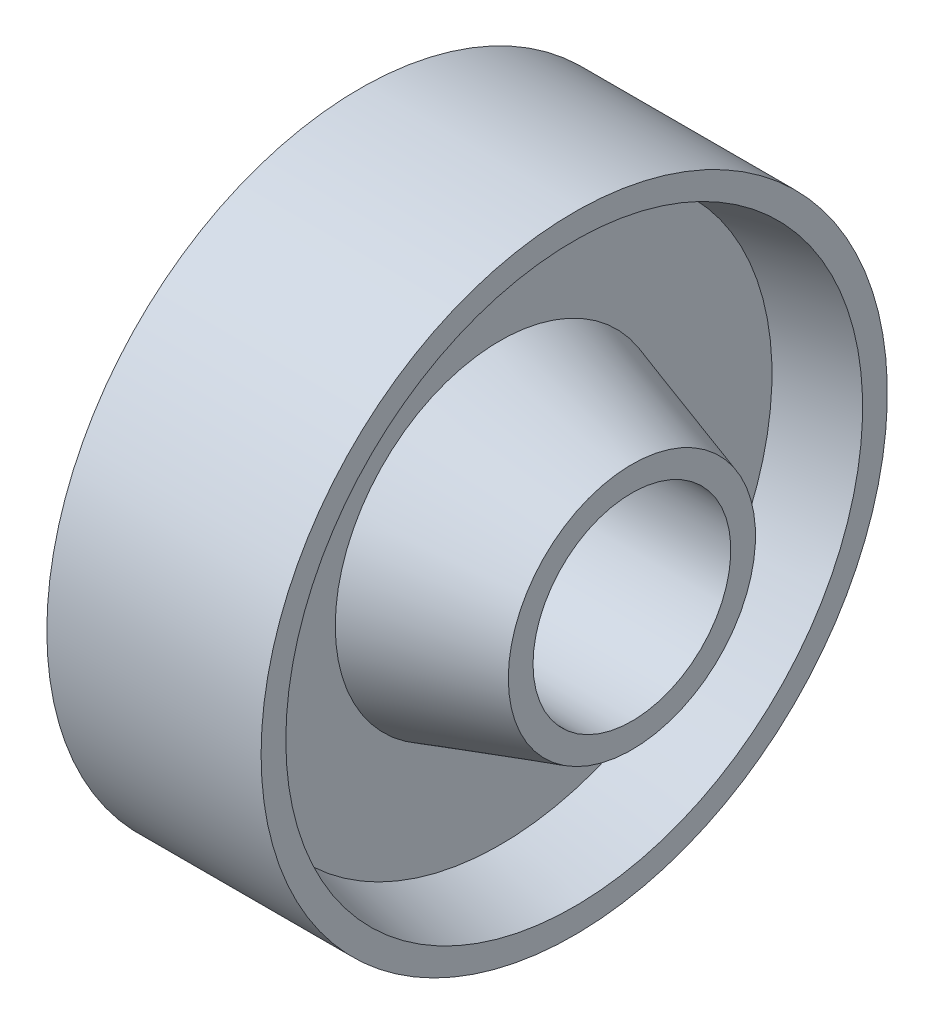
ISO-10303-21;
HEADER;
FILE_DESCRIPTION(('STEP AP214'),'2;1');
FILE_NAME('part.step','',(''),(''),'','','');
FILE_SCHEMA(('AUTOMOTIVE_DESIGN { 1 0 10303 214 1 1 1 1 }'));
ENDSEC;
DATA;
#1=APPLICATION_CONTEXT('core data for automotive mechanical design processes');
#2=APPLICATION_PROTOCOL_DEFINITION('international standard','automotive_design',2000,#1);
#3=PRODUCT_CONTEXT('',#1,'mechanical');
#4=PRODUCT('Part','Part','',(#3));
#5=PRODUCT_RELATED_PRODUCT_CATEGORY('part','',(#4));
#6=PRODUCT_DEFINITION_FORMATION('','',#4);
#7=PRODUCT_DEFINITION_CONTEXT('part definition',#1,'design');
#8=PRODUCT_DEFINITION('design','',#6,#7);
#9=PRODUCT_DEFINITION_SHAPE('','',#8);
#10=(LENGTH_UNIT() NAMED_UNIT(*) SI_UNIT(.MILLI.,.METRE.));
#11=(NAMED_UNIT(*) PLANE_ANGLE_UNIT() SI_UNIT($,.RADIAN.));
#12=(NAMED_UNIT(*) SI_UNIT($,.STERADIAN.) SOLID_ANGLE_UNIT());
#13=UNCERTAINTY_MEASURE_WITH_UNIT(LENGTH_MEASURE(1.E-05),#10,'distance_accuracy_value','');
#14=(GEOMETRIC_REPRESENTATION_CONTEXT(3) GLOBAL_UNCERTAINTY_ASSIGNED_CONTEXT((#13)) GLOBAL_UNIT_ASSIGNED_CONTEXT((#10,
#11,#12)) REPRESENTATION_CONTEXT('',''));
#15=CARTESIAN_POINT('',(0.,0.,0.));
#16=DIRECTION('',(0.,0.,1.));
#17=DIRECTION('',(1.,0.,0.));
#18=AXIS2_PLACEMENT_3D('',#15,#16,#17);
#19=CARTESIAN_POINT('',(-25.4315584222309,0.,0.));
#20=DIRECTION('',(-1.,0.,0.));
#21=DIRECTION('',(0.,0.,1.));
#22=AXIS2_PLACEMENT_3D('',#19,#20,#21);
#23=CYLINDRICAL_SURFACE('',#22,38.);
#24=CARTESIAN_POINT('',(-13.,0.,0.));
#25=DIRECTION('',(-1.,0.,0.));
#26=DIRECTION('',(0.,0.,1.));
#27=AXIS2_PLACEMENT_3D('',#24,#25,#26);
#28=CIRCLE('',#27,38.);
#29=CARTESIAN_POINT('',(-13.,0.,38.));
#30=VERTEX_POINT('',#29);
#31=EDGE_CURVE('E10',#30,#30,#28,.T.);
#32=ORIENTED_EDGE('',*,*,#31,.F.);
#33=EDGE_LOOP('',(#32));
#34=FACE_BOUND('',#33,.T.);
#35=CARTESIAN_POINT('',(13.,0.,0.));
#36=DIRECTION('',(-1.,0.,0.));
#37=DIRECTION('',(0.,0.,1.));
#38=AXIS2_PLACEMENT_3D('',#35,#36,#37);
#39=CIRCLE('',#38,38.);
#40=CARTESIAN_POINT('',(13.,0.,38.));
#41=VERTEX_POINT('',#40);
#42=EDGE_CURVE('E92',#41,#41,#39,.T.);
#43=ORIENTED_EDGE('',*,*,#42,.T.);
#44=EDGE_LOOP('',(#43));
#45=FACE_BOUND('',#44,.T.);
#46=ADVANCED_FACE('F41',(#34,#45),#23,.T.);
#47=CARTESIAN_POINT('',(-13.,35.,0.));
#48=DIRECTION('',(1.,0.,0.));
#49=DIRECTION('',(0.,0.,-1.));
#50=AXIS2_PLACEMENT_3D('',#47,#48,#49);
#51=PLANE('',#50);
#52=CARTESIAN_POINT('',(-13.,0.,0.));
#53=DIRECTION('',(-1.,0.,0.));
#54=DIRECTION('',(0.,0.,1.));
#55=AXIS2_PLACEMENT_3D('',#52,#53,#54);
#56=CIRCLE('',#55,35.);
#57=CARTESIAN_POINT('',(-13.,0.,35.));
#58=VERTEX_POINT('',#57);
#59=EDGE_CURVE('E48',#58,#58,#56,.T.);
#60=ORIENTED_EDGE('',*,*,#59,.F.);
#61=EDGE_LOOP('',(#60));
#62=FACE_BOUND('',#61,.T.);
#63=ORIENTED_EDGE('',*,*,#31,.T.);
#64=EDGE_LOOP('',(#63));
#65=FACE_BOUND('',#64,.T.);
#66=ADVANCED_FACE('F154',(#62,#65),#51,.F.);
#67=CARTESIAN_POINT('',(-13.,0.,0.));
#68=DIRECTION('',(-1.,0.,0.));
#69=DIRECTION('',(0.,0.,1.));
#70=AXIS2_PLACEMENT_3D('',#67,#68,#69);
#71=CONICAL_SURFACE('',#70,35.,0.218668945873942);
#72=CARTESIAN_POINT('',(-4.,0.,0.));
#73=DIRECTION('',(-1.,0.,0.));
#74=DIRECTION('',(0.,0.,1.));
#75=AXIS2_PLACEMENT_3D('',#72,#73,#74);
#76=CIRCLE('',#75,33.);
#77=CARTESIAN_POINT('',(-4.,0.,33.));
#78=VERTEX_POINT('',#77);
#79=EDGE_CURVE('E53',#78,#78,#76,.T.);
#80=ORIENTED_EDGE('',*,*,#79,.F.);
#81=EDGE_LOOP('',(#80));
#82=FACE_BOUND('',#81,.T.);
#83=ORIENTED_EDGE('',*,*,#59,.T.);
#84=EDGE_LOOP('',(#83));
#85=FACE_BOUND('',#84,.T.);
#86=ADVANCED_FACE('F149',(#82,#85),#71,.F.);
#87=CARTESIAN_POINT('',(-4.,20.,0.));
#88=DIRECTION('',(1.,0.,0.));
#89=DIRECTION('',(0.,0.,-1.));
#90=AXIS2_PLACEMENT_3D('',#87,#88,#89);
#91=PLANE('',#90);
#92=CARTESIAN_POINT('',(-4.,0.,0.));
#93=DIRECTION('',(-1.,0.,0.));
#94=DIRECTION('',(0.,0.,1.));
#95=AXIS2_PLACEMENT_3D('',#92,#93,#94);
#96=CIRCLE('',#95,20.);
#97=CARTESIAN_POINT('',(-4.,0.,20.));
#98=VERTEX_POINT('',#97);
#99=EDGE_CURVE('E58',#98,#98,#96,.T.);
#100=ORIENTED_EDGE('',*,*,#99,.F.);
#101=EDGE_LOOP('',(#100));
#102=FACE_BOUND('',#101,.T.);
#103=ORIENTED_EDGE('',*,*,#79,.T.);
#104=EDGE_LOOP('',(#103));
#105=FACE_BOUND('',#104,.T.);
#106=ADVANCED_FACE('F143',(#102,#105),#91,.F.);
#107=CARTESIAN_POINT('',(-4.,0.,0.));
#108=DIRECTION('',(1.,0.,0.));
#109=DIRECTION('',(0.,0.,-1.));
#110=AXIS2_PLACEMENT_3D('',#107,#108,#109);
#111=CONICAL_SURFACE('',#110,20.,0.302884868374971);
#112=CARTESIAN_POINT('',(-20.,0.,0.));
#113=DIRECTION('',(-1.,0.,0.));
#114=DIRECTION('',(0.,0.,1.));
#115=AXIS2_PLACEMENT_3D('',#112,#113,#114);
#116=CIRCLE('',#115,15.);
#117=CARTESIAN_POINT('',(-20.,0.,15.));
#118=VERTEX_POINT('',#117);
#119=EDGE_CURVE('E64',#118,#118,#116,.T.);
#120=ORIENTED_EDGE('',*,*,#119,.F.);
#121=EDGE_LOOP('',(#120));
#122=FACE_BOUND('',#121,.T.);
#123=ORIENTED_EDGE('',*,*,#99,.T.);
#124=EDGE_LOOP('',(#123));
#125=FACE_BOUND('',#124,.T.);
#126=ADVANCED_FACE('F137',(#122,#125),#111,.T.);
#127=CARTESIAN_POINT('',(-20.,12.,0.));
#128=DIRECTION('',(1.,0.,0.));
#129=DIRECTION('',(0.,0.,-1.));
#130=AXIS2_PLACEMENT_3D('',#127,#128,#129);
#131=PLANE('',#130);
#132=CARTESIAN_POINT('',(-20.,0.,0.));
#133=DIRECTION('',(-1.,0.,0.));
#134=DIRECTION('',(0.,0.,1.));
#135=AXIS2_PLACEMENT_3D('',#132,#133,#134);
#136=CIRCLE('',#135,12.);
#137=CARTESIAN_POINT('',(-20.,0.,12.));
#138=VERTEX_POINT('',#137);
#139=EDGE_CURVE('E68',#138,#138,#136,.T.);
#140=ORIENTED_EDGE('',*,*,#139,.F.);
#141=EDGE_LOOP('',(#140));
#142=FACE_BOUND('',#141,.T.);
#143=ORIENTED_EDGE('',*,*,#119,.T.);
#144=EDGE_LOOP('',(#143));
#145=FACE_BOUND('',#144,.T.);
#146=ADVANCED_FACE('F131',(#142,#145),#131,.F.);
#147=CARTESIAN_POINT('',(-25.4315584222309,0.,0.));
#148=DIRECTION('',(-1.,0.,0.));
#149=DIRECTION('',(0.,0.,1.));
#150=AXIS2_PLACEMENT_3D('',#147,#148,#149);
#151=CYLINDRICAL_SURFACE('',#150,12.);
#152=CARTESIAN_POINT('',(20.,0.,0.));
#153=DIRECTION('',(-1.,0.,0.));
#154=DIRECTION('',(0.,0.,1.));
#155=AXIS2_PLACEMENT_3D('',#152,#153,#154);
#156=CIRCLE('',#155,12.);
#157=CARTESIAN_POINT('',(20.,0.,12.));
#158=VERTEX_POINT('',#157);
#159=EDGE_CURVE('E72',#158,#158,#156,.T.);
#160=ORIENTED_EDGE('',*,*,#159,.F.);
#161=EDGE_LOOP('',(#160));
#162=FACE_BOUND('',#161,.T.);
#163=ORIENTED_EDGE('',*,*,#139,.T.);
#164=EDGE_LOOP('',(#163));
#165=FACE_BOUND('',#164,.T.);
#166=ADVANCED_FACE('F125',(#162,#165),#151,.F.);
#167=CARTESIAN_POINT('',(20.,12.,0.));
#168=DIRECTION('',(-1.,0.,0.));
#169=DIRECTION('',(0.,0.,1.));
#170=AXIS2_PLACEMENT_3D('',#167,#168,#169);
#171=PLANE('',#170);
#172=CARTESIAN_POINT('',(20.,0.,0.));
#173=DIRECTION('',(-1.,0.,0.));
#174=DIRECTION('',(0.,0.,1.));
#175=AXIS2_PLACEMENT_3D('',#172,#173,#174);
#176=CIRCLE('',#175,15.);
#177=CARTESIAN_POINT('',(20.,0.,15.));
#178=VERTEX_POINT('',#177);
#179=EDGE_CURVE('E76',#178,#178,#176,.T.);
#180=ORIENTED_EDGE('',*,*,#179,.F.);
#181=EDGE_LOOP('',(#180));
#182=FACE_BOUND('',#181,.T.);
#183=ORIENTED_EDGE('',*,*,#159,.T.);
#184=EDGE_LOOP('',(#183));
#185=FACE_BOUND('',#184,.T.);
#186=ADVANCED_FACE('F119',(#182,#185),#171,.F.);
#187=CARTESIAN_POINT('',(20.,0.,0.));
#188=DIRECTION('',(-1.,0.,0.));
#189=DIRECTION('',(0.,0.,1.));
#190=AXIS2_PLACEMENT_3D('',#187,#188,#189);
#191=CONICAL_SURFACE('',#190,15.,0.302884868374971);
#192=CARTESIAN_POINT('',(4.,0.,0.));
#193=DIRECTION('',(-1.,0.,0.));
#194=DIRECTION('',(0.,0.,1.));
#195=AXIS2_PLACEMENT_3D('',#192,#193,#194);
#196=CIRCLE('',#195,20.);
#197=CARTESIAN_POINT('',(4.,0.,20.));
#198=VERTEX_POINT('',#197);
#199=EDGE_CURVE('E80',#198,#198,#196,.T.);
#200=ORIENTED_EDGE('',*,*,#199,.F.);
#201=EDGE_LOOP('',(#200));
#202=FACE_BOUND('',#201,.T.);
#203=ORIENTED_EDGE('',*,*,#179,.T.);
#204=EDGE_LOOP('',(#203));
#205=FACE_BOUND('',#204,.T.);
#206=ADVANCED_FACE('F113',(#202,#205),#191,.T.);
#207=CARTESIAN_POINT('',(4.,20.,0.));
#208=DIRECTION('',(-1.,0.,0.));
#209=DIRECTION('',(0.,0.,1.));
#210=AXIS2_PLACEMENT_3D('',#207,#208,#209);
#211=PLANE('',#210);
#212=CARTESIAN_POINT('',(4.,0.,0.));
#213=DIRECTION('',(-1.,0.,0.));
#214=DIRECTION('',(0.,0.,1.));
#215=AXIS2_PLACEMENT_3D('',#212,#213,#214);
#216=CIRCLE('',#215,33.);
#217=CARTESIAN_POINT('',(4.,0.,33.));
#218=VERTEX_POINT('',#217);
#219=EDGE_CURVE('E84',#218,#218,#216,.T.);
#220=ORIENTED_EDGE('',*,*,#219,.F.);
#221=EDGE_LOOP('',(#220));
#222=FACE_BOUND('',#221,.T.);
#223=ORIENTED_EDGE('',*,*,#199,.T.);
#224=EDGE_LOOP('',(#223));
#225=FACE_BOUND('',#224,.T.);
#226=ADVANCED_FACE('F107',(#222,#225),#211,.F.);
#227=CARTESIAN_POINT('',(4.,0.,0.));
#228=DIRECTION('',(1.,0.,0.));
#229=DIRECTION('',(0.,0.,-1.));
#230=AXIS2_PLACEMENT_3D('',#227,#228,#229);
#231=CONICAL_SURFACE('',#230,33.,0.218668945873942);
#232=CARTESIAN_POINT('',(13.,0.,0.));
#233=DIRECTION('',(-1.,0.,0.));
#234=DIRECTION('',(0.,0.,1.));
#235=AXIS2_PLACEMENT_3D('',#232,#233,#234);
#236=CIRCLE('',#235,35.);
#237=CARTESIAN_POINT('',(13.,0.,35.));
#238=VERTEX_POINT('',#237);
#239=EDGE_CURVE('E88',#238,#238,#236,.T.);
#240=ORIENTED_EDGE('',*,*,#239,.F.);
#241=EDGE_LOOP('',(#240));
#242=FACE_BOUND('',#241,.T.);
#243=ORIENTED_EDGE('',*,*,#219,.T.);
#244=EDGE_LOOP('',(#243));
#245=FACE_BOUND('',#244,.T.);
#246=ADVANCED_FACE('F101',(#242,#245),#231,.F.);
#247=CARTESIAN_POINT('',(13.,35.,0.));
#248=DIRECTION('',(-1.,0.,0.));
#249=DIRECTION('',(0.,0.,1.));
#250=AXIS2_PLACEMENT_3D('',#247,#248,#249);
#251=PLANE('',#250);
#252=ORIENTED_EDGE('',*,*,#42,.F.);
#253=EDGE_LOOP('',(#252));
#254=FACE_BOUND('',#253,.T.);
#255=ORIENTED_EDGE('',*,*,#239,.T.);
#256=EDGE_LOOP('',(#255));
#257=FACE_BOUND('',#256,.T.);
#258=ADVANCED_FACE('F98',(#254,#257),#251,.F.);
#259=CLOSED_SHELL('',(#46,#66,#86,#106,#126,#146,#166,#186,#206,#226,#246,#258));
#260=MANIFOLD_SOLID_BREP('B2',#259);
#261=ADVANCED_BREP_SHAPE_REPRESENTATION('',(#18,#260),#14);
#262=SHAPE_DEFINITION_REPRESENTATION(#9,#261);
ENDSEC;
END-ISO-10303-21;
